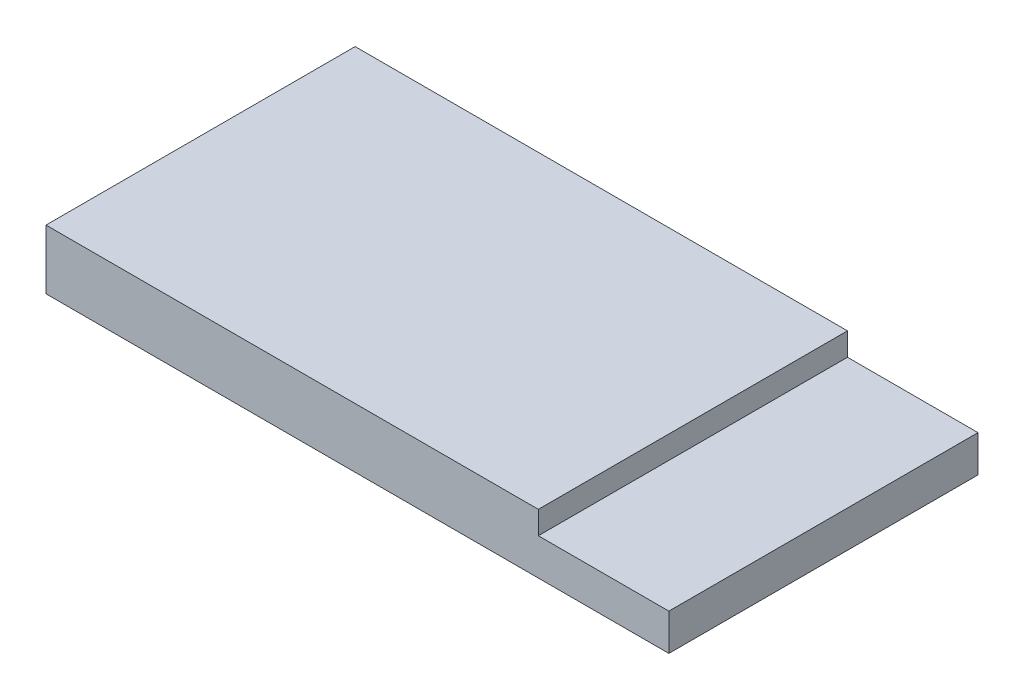
ISO-10303-21;
HEADER;
FILE_DESCRIPTION(('STEP AP214'),'2;1');
FILE_NAME('part.step','',(''),(''),'','','');
FILE_SCHEMA(('AUTOMOTIVE_DESIGN { 1 0 10303 214 1 1 1 1 }'));
ENDSEC;
DATA;
#1=APPLICATION_CONTEXT('core data for automotive mechanical design processes');
#2=APPLICATION_PROTOCOL_DEFINITION('international standard','automotive_design',2000,#1);
#3=PRODUCT_CONTEXT('',#1,'mechanical');
#4=PRODUCT('Part','Part','',(#3));
#5=PRODUCT_RELATED_PRODUCT_CATEGORY('part','',(#4));
#6=PRODUCT_DEFINITION_FORMATION('','',#4);
#7=PRODUCT_DEFINITION_CONTEXT('part definition',#1,'design');
#8=PRODUCT_DEFINITION('design','',#6,#7);
#9=PRODUCT_DEFINITION_SHAPE('','',#8);
#10=(LENGTH_UNIT() NAMED_UNIT(*) SI_UNIT(.MILLI.,.METRE.));
#11=(NAMED_UNIT(*) PLANE_ANGLE_UNIT() SI_UNIT($,.RADIAN.));
#12=(NAMED_UNIT(*) SI_UNIT($,.STERADIAN.) SOLID_ANGLE_UNIT());
#13=UNCERTAINTY_MEASURE_WITH_UNIT(LENGTH_MEASURE(1.E-05),#10,'distance_accuracy_value','');
#14=(GEOMETRIC_REPRESENTATION_CONTEXT(3) GLOBAL_UNCERTAINTY_ASSIGNED_CONTEXT((#13)) GLOBAL_UNIT_ASSIGNED_CONTEXT((#10,
#11,#12)) REPRESENTATION_CONTEXT('',''));
#15=CARTESIAN_POINT('',(0.,0.,0.));
#16=DIRECTION('',(0.,0.,1.));
#17=DIRECTION('',(1.,0.,0.));
#18=AXIS2_PLACEMENT_3D('',#15,#16,#17);
#19=CARTESIAN_POINT('',(-13.6,1.6,-6.75));
#20=DIRECTION('',(1.,0.,0.));
#21=DIRECTION('',(0.,0.,-1.));
#22=AXIS2_PLACEMENT_3D('',#19,#20,#21);
#23=PLANE('',#22);
#24=DIRECTION('',(0.,0.,1.));
#25=VECTOR('',#24,1.);
#26=CARTESIAN_POINT('',(-13.6,0.,-6.75));
#27=LINE('',#26,#25);
#28=CARTESIAN_POINT('',(-13.6,0.,-6.75));
#29=VERTEX_POINT('',#28);
#30=CARTESIAN_POINT('',(-13.6,0.,6.75));
#31=VERTEX_POINT('',#30);
#32=EDGE_CURVE('E105',#29,#31,#27,.T.);
#33=ORIENTED_EDGE('',*,*,#32,.T.);
#34=DIRECTION('',(0.,-1.,0.));
#35=VECTOR('',#34,1.);
#36=CARTESIAN_POINT('',(-13.6,1.6,6.75));
#37=LINE('',#36,#35);
#38=CARTESIAN_POINT('',(-13.6,2.6,6.75));
#39=VERTEX_POINT('',#38);
#40=EDGE_CURVE('E11',#39,#31,#37,.T.);
#41=ORIENTED_EDGE('',*,*,#40,.F.);
#42=DIRECTION('',(0.,0.,1.));
#43=VECTOR('',#42,1.);
#44=CARTESIAN_POINT('',(-13.6,2.6,6.75));
#45=LINE('',#44,#43);
#46=CARTESIAN_POINT('',(-13.6,2.6,-6.75));
#47=VERTEX_POINT('',#46);
#48=EDGE_CURVE('E99',#47,#39,#45,.T.);
#49=ORIENTED_EDGE('',*,*,#48,.F.);
#50=DIRECTION('',(0.,-1.,0.));
#51=VECTOR('',#50,1.);
#52=CARTESIAN_POINT('',(-13.6,1.6,-6.75));
#53=LINE('',#52,#51);
#54=EDGE_CURVE('E88',#47,#29,#53,.T.);
#55=ORIENTED_EDGE('',*,*,#54,.T.);
#56=EDGE_LOOP('',(#33,#41,#49,#55));
#57=FACE_BOUND('',#56,.T.);
#58=ADVANCED_FACE('F32',(#57),#23,.F.);
#59=CARTESIAN_POINT('',(-13.6,1.6,6.75));
#60=DIRECTION('',(0.,0.,-1.));
#61=DIRECTION('',(-1.,0.,0.));
#62=AXIS2_PLACEMENT_3D('',#59,#60,#61);
#63=PLANE('',#62);
#64=DIRECTION('',(1.,0.,0.));
#65=VECTOR('',#64,1.);
#66=CARTESIAN_POINT('',(-13.6,0.,6.75));
#67=LINE('',#66,#65);
#68=CARTESIAN_POINT('',(13.6,0.,6.75));
#69=VERTEX_POINT('',#68);
#70=EDGE_CURVE('E122',#31,#69,#67,.T.);
#71=ORIENTED_EDGE('',*,*,#70,.T.);
#72=DIRECTION('',(0.,-1.,0.));
#73=VECTOR('',#72,1.);
#74=CARTESIAN_POINT('',(13.6,1.6,6.75));
#75=LINE('',#74,#73);
#76=CARTESIAN_POINT('',(13.6,1.6,6.75));
#77=VERTEX_POINT('',#76);
#78=EDGE_CURVE('E40',#77,#69,#75,.T.);
#79=ORIENTED_EDGE('',*,*,#78,.F.);
#80=DIRECTION('',(1.,0.,0.));
#81=VECTOR('',#80,1.);
#82=CARTESIAN_POINT('',(-13.6,1.6,6.75));
#83=LINE('',#82,#81);
#84=CARTESIAN_POINT('',(7.9,1.6,6.75));
#85=VERTEX_POINT('',#84);
#86=EDGE_CURVE('E128',#85,#77,#83,.T.);
#87=ORIENTED_EDGE('',*,*,#86,.F.);
#88=DIRECTION('',(0.,-1.,0.));
#89=VECTOR('',#88,1.);
#90=CARTESIAN_POINT('',(7.9,2.6,6.75));
#91=LINE('',#90,#89);
#92=CARTESIAN_POINT('',(7.9,2.6,6.75));
#93=VERTEX_POINT('',#92);
#94=EDGE_CURVE('E98',#93,#85,#91,.T.);
#95=ORIENTED_EDGE('',*,*,#94,.F.);
#96=DIRECTION('',(1.,0.,0.));
#97=VECTOR('',#96,1.);
#98=CARTESIAN_POINT('',(-13.6,2.6,6.75));
#99=LINE('',#98,#97);
#100=EDGE_CURVE('E117',#39,#93,#99,.T.);
#101=ORIENTED_EDGE('',*,*,#100,.F.);
#102=ORIENTED_EDGE('',*,*,#40,.T.);
#103=EDGE_LOOP('',(#71,#79,#87,#95,#101,#102));
#104=FACE_BOUND('',#103,.T.);
#105=ADVANCED_FACE('F148',(#104),#63,.F.);
#106=CARTESIAN_POINT('',(13.6,1.6,-6.75));
#107=DIRECTION('',(-1.,0.,0.));
#108=DIRECTION('',(0.,0.,1.));
#109=AXIS2_PLACEMENT_3D('',#106,#107,#108);
#110=PLANE('',#109);
#111=DIRECTION('',(0.,0.,-1.));
#112=VECTOR('',#111,1.);
#113=CARTESIAN_POINT('',(13.6,0.,-6.75));
#114=LINE('',#113,#112);
#115=CARTESIAN_POINT('',(13.6,0.,-6.75));
#116=VERTEX_POINT('',#115);
#117=EDGE_CURVE('E124',#69,#116,#114,.T.);
#118=ORIENTED_EDGE('',*,*,#117,.T.);
#119=DIRECTION('',(0.,-1.,0.));
#120=VECTOR('',#119,1.);
#121=CARTESIAN_POINT('',(13.6,1.6,-6.75));
#122=LINE('',#121,#120);
#123=CARTESIAN_POINT('',(13.6,1.6,-6.75));
#124=VERTEX_POINT('',#123);
#125=EDGE_CURVE('E134',#124,#116,#122,.T.);
#126=ORIENTED_EDGE('',*,*,#125,.F.);
#127=DIRECTION('',(0.,0.,-1.));
#128=VECTOR('',#127,1.);
#129=CARTESIAN_POINT('',(13.6,1.6,-6.75));
#130=LINE('',#129,#128);
#131=EDGE_CURVE('E53',#77,#124,#130,.T.);
#132=ORIENTED_EDGE('',*,*,#131,.F.);
#133=ORIENTED_EDGE('',*,*,#78,.T.);
#134=EDGE_LOOP('',(#118,#126,#132,#133));
#135=FACE_BOUND('',#134,.T.);
#136=ADVANCED_FACE('F161',(#135),#110,.F.);
#137=CARTESIAN_POINT('',(-13.6,1.6,-6.75));
#138=DIRECTION('',(0.,0.,1.));
#139=DIRECTION('',(1.,0.,0.));
#140=AXIS2_PLACEMENT_3D('',#137,#138,#139);
#141=PLANE('',#140);
#142=DIRECTION('',(-1.,0.,0.));
#143=VECTOR('',#142,1.);
#144=CARTESIAN_POINT('',(-13.6,0.,-6.75));
#145=LINE('',#144,#143);
#146=EDGE_CURVE('E126',#116,#29,#145,.T.);
#147=ORIENTED_EDGE('',*,*,#146,.T.);
#148=ORIENTED_EDGE('',*,*,#54,.F.);
#149=DIRECTION('',(-1.,0.,0.));
#150=VECTOR('',#149,1.);
#151=CARTESIAN_POINT('',(-13.6,2.6,-6.75));
#152=LINE('',#151,#150);
#153=CARTESIAN_POINT('',(7.9,2.6,-6.75));
#154=VERTEX_POINT('',#153);
#155=EDGE_CURVE('E103',#154,#47,#152,.T.);
#156=ORIENTED_EDGE('',*,*,#155,.F.);
#157=DIRECTION('',(0.,-1.,0.));
#158=VECTOR('',#157,1.);
#159=CARTESIAN_POINT('',(7.9,2.6,-6.75));
#160=LINE('',#159,#158);
#161=CARTESIAN_POINT('',(7.9,1.6,-6.75));
#162=VERTEX_POINT('',#161);
#163=EDGE_CURVE('E95',#154,#162,#160,.T.);
#164=ORIENTED_EDGE('',*,*,#163,.T.);
#165=DIRECTION('',(-1.,0.,0.));
#166=VECTOR('',#165,1.);
#167=CARTESIAN_POINT('',(-13.6,1.6,-6.75));
#168=LINE('',#167,#166);
#169=EDGE_CURVE('E83',#124,#162,#168,.T.);
#170=ORIENTED_EDGE('',*,*,#169,.F.);
#171=ORIENTED_EDGE('',*,*,#125,.T.);
#172=EDGE_LOOP('',(#147,#148,#156,#164,#170,#171));
#173=FACE_BOUND('',#172,.T.);
#174=ADVANCED_FACE('F101',(#173),#141,.F.);
#175=CARTESIAN_POINT('',(-13.6,1.6,-6.75));
#176=DIRECTION('',(0.,1.,0.));
#177=DIRECTION('',(0.,0.,1.));
#178=AXIS2_PLACEMENT_3D('',#175,#176,#177);
#179=PLANE('',#178);
#180=DIRECTION('',(0.,0.,-1.));
#181=VECTOR('',#180,1.);
#182=CARTESIAN_POINT('',(7.9,1.6,6.75));
#183=LINE('',#182,#181);
#184=EDGE_CURVE('E48',#85,#162,#183,.T.);
#185=ORIENTED_EDGE('',*,*,#184,.F.);
#186=ORIENTED_EDGE('',*,*,#86,.T.);
#187=ORIENTED_EDGE('',*,*,#131,.T.);
#188=ORIENTED_EDGE('',*,*,#169,.T.);
#189=EDGE_LOOP('',(#185,#186,#187,#188));
#190=FACE_BOUND('',#189,.T.);
#191=ADVANCED_FACE('F84',(#190),#179,.T.);
#192=CARTESIAN_POINT('',(-13.6,0.,-6.75));
#193=DIRECTION('',(0.,1.,0.));
#194=DIRECTION('',(0.,0.,1.));
#195=AXIS2_PLACEMENT_3D('',#192,#193,#194);
#196=PLANE('',#195);
#197=ORIENTED_EDGE('',*,*,#32,.F.);
#198=ORIENTED_EDGE('',*,*,#146,.F.);
#199=ORIENTED_EDGE('',*,*,#117,.F.);
#200=ORIENTED_EDGE('',*,*,#70,.F.);
#201=EDGE_LOOP('',(#197,#198,#199,#200));
#202=FACE_BOUND('',#201,.T.);
#203=ADVANCED_FACE('F143',(#202),#196,.F.);
#204=CARTESIAN_POINT('',(7.9,2.6,6.75));
#205=DIRECTION('',(-1.,0.,0.));
#206=DIRECTION('',(0.,0.,1.));
#207=AXIS2_PLACEMENT_3D('',#204,#205,#206);
#208=PLANE('',#207);
#209=ORIENTED_EDGE('',*,*,#184,.T.);
#210=ORIENTED_EDGE('',*,*,#163,.F.);
#211=DIRECTION('',(0.,0.,-1.));
#212=VECTOR('',#211,1.);
#213=CARTESIAN_POINT('',(7.9,2.6,6.75));
#214=LINE('',#213,#212);
#215=EDGE_CURVE('E106',#93,#154,#214,.T.);
#216=ORIENTED_EDGE('',*,*,#215,.F.);
#217=ORIENTED_EDGE('',*,*,#94,.T.);
#218=EDGE_LOOP('',(#209,#210,#216,#217));
#219=FACE_BOUND('',#218,.T.);
#220=ADVANCED_FACE('F93',(#219),#208,.F.);
#221=CARTESIAN_POINT('',(-13.6,2.6,-6.75));
#222=DIRECTION('',(0.,-1.,0.));
#223=DIRECTION('',(0.,0.,-1.));
#224=AXIS2_PLACEMENT_3D('',#221,#222,#223);
#225=PLANE('',#224);
#226=ORIENTED_EDGE('',*,*,#48,.T.);
#227=ORIENTED_EDGE('',*,*,#100,.T.);
#228=ORIENTED_EDGE('',*,*,#215,.T.);
#229=ORIENTED_EDGE('',*,*,#155,.T.);
#230=EDGE_LOOP('',(#226,#227,#228,#229));
#231=FACE_BOUND('',#230,.T.);
#232=ADVANCED_FACE('F150',(#231),#225,.F.);
#233=CLOSED_SHELL('',(#58,#105,#136,#174,#191,#203,#220,#232));
#234=MANIFOLD_SOLID_BREP('B2',#233);
#235=ADVANCED_BREP_SHAPE_REPRESENTATION('',(#18,#234),#14);
#236=SHAPE_DEFINITION_REPRESENTATION(#9,#235);
ENDSEC;
END-ISO-10303-21;
